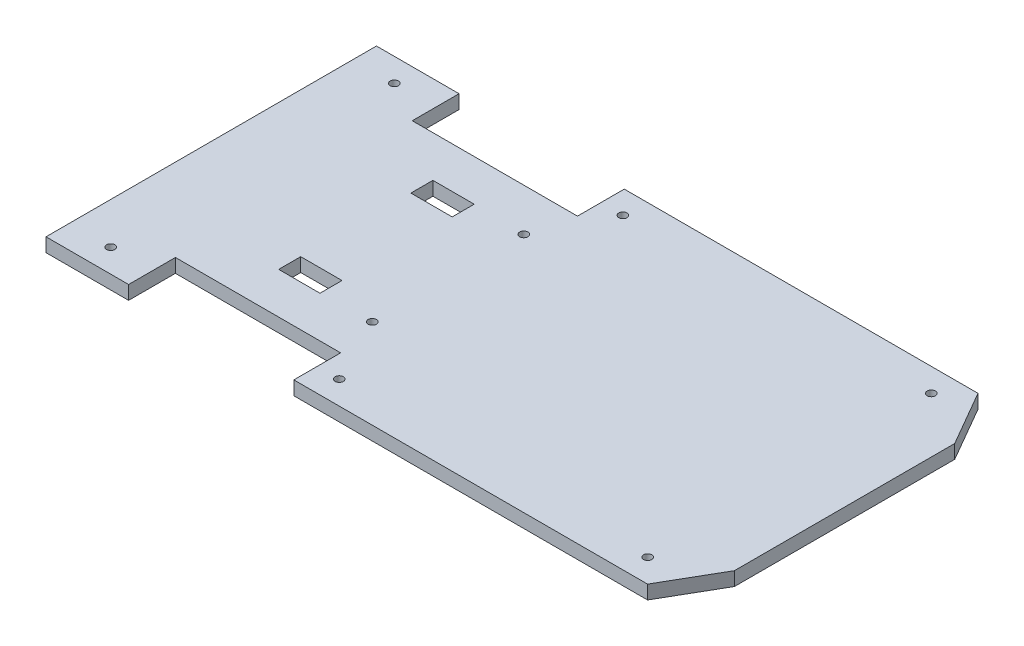
ISO-10303-21;
HEADER;
FILE_DESCRIPTION(('STEP AP214'),'2;1');
FILE_NAME('part.step','',(''),(''),'','','');
FILE_SCHEMA(('AUTOMOTIVE_DESIGN { 1 0 10303 214 1 1 1 1 }'));
ENDSEC;
DATA;
#1=APPLICATION_CONTEXT('core data for automotive mechanical design processes');
#2=APPLICATION_PROTOCOL_DEFINITION('international standard','automotive_design',2000,#1);
#3=PRODUCT_CONTEXT('',#1,'mechanical');
#4=PRODUCT('Part','Part','',(#3));
#5=PRODUCT_RELATED_PRODUCT_CATEGORY('part','',(#4));
#6=PRODUCT_DEFINITION_FORMATION('','',#4);
#7=PRODUCT_DEFINITION_CONTEXT('part definition',#1,'design');
#8=PRODUCT_DEFINITION('design','',#6,#7);
#9=PRODUCT_DEFINITION_SHAPE('','',#8);
#10=(LENGTH_UNIT() NAMED_UNIT(*) SI_UNIT(.MILLI.,.METRE.));
#11=(NAMED_UNIT(*) PLANE_ANGLE_UNIT() SI_UNIT($,.RADIAN.));
#12=(NAMED_UNIT(*) SI_UNIT($,.STERADIAN.) SOLID_ANGLE_UNIT());
#13=UNCERTAINTY_MEASURE_WITH_UNIT(LENGTH_MEASURE(1.E-05),#10,'distance_accuracy_value','');
#14=(GEOMETRIC_REPRESENTATION_CONTEXT(3) GLOBAL_UNCERTAINTY_ASSIGNED_CONTEXT((#13)) GLOBAL_UNIT_ASSIGNED_CONTEXT((#10,
#11,#12)) REPRESENTATION_CONTEXT('',''));
#15=CARTESIAN_POINT('',(0.,0.,0.));
#16=DIRECTION('',(0.,0.,1.));
#17=DIRECTION('',(1.,0.,0.));
#18=AXIS2_PLACEMENT_3D('',#15,#16,#17);
#19=CARTESIAN_POINT('',(0.,5.,0.));
#20=DIRECTION('',(0.,-1.,0.));
#21=DIRECTION('',(0.,0.,-1.));
#22=AXIS2_PLACEMENT_3D('',#19,#20,#21);
#23=PLANE('',#22);
#24=DIRECTION('',(0.,0.,1.));
#25=VECTOR('',#24,1.);
#26=CARTESIAN_POINT('',(-115.,5.,0.));
#27=LINE('',#26,#25);
#28=CARTESIAN_POINT('',(-115.,5.,-60.));
#29=VERTEX_POINT('',#28);
#30=CARTESIAN_POINT('',(-115.,5.,60.));
#31=VERTEX_POINT('',#30);
#32=EDGE_CURVE('E386',#29,#31,#27,.T.);
#33=ORIENTED_EDGE('',*,*,#32,.T.);
#34=DIRECTION('',(-1.,0.,0.));
#35=VECTOR('',#34,1.);
#36=CARTESIAN_POINT('',(-115.,5.,60.));
#37=LINE('',#36,#35);
#38=CARTESIAN_POINT('',(-85.,5.,60.));
#39=VERTEX_POINT('',#38);
#40=EDGE_CURVE('E246',#39,#31,#37,.T.);
#41=ORIENTED_EDGE('',*,*,#40,.F.);
#42=DIRECTION('',(0.,0.,1.));
#43=VECTOR('',#42,1.);
#44=CARTESIAN_POINT('',(-85.,5.,60.));
#45=LINE('',#44,#43);
#46=CARTESIAN_POINT('',(-85.,5.,43.));
#47=VERTEX_POINT('',#46);
#48=EDGE_CURVE('E250',#47,#39,#45,.T.);
#49=ORIENTED_EDGE('',*,*,#48,.F.);
#50=DIRECTION('',(-1.,0.,0.));
#51=VECTOR('',#50,1.);
#52=CARTESIAN_POINT('',(-85.,5.,43.));
#53=LINE('',#52,#51);
#54=CARTESIAN_POINT('',(-25.,5.,43.));
#55=VERTEX_POINT('',#54);
#56=EDGE_CURVE('E255',#55,#47,#53,.T.);
#57=ORIENTED_EDGE('',*,*,#56,.F.);
#58=DIRECTION('',(0.,0.,-1.));
#59=VECTOR('',#58,1.);
#60=CARTESIAN_POINT('',(-25.,5.,43.));
#61=LINE('',#60,#59);
#62=CARTESIAN_POINT('',(-25.,5.,60.));
#63=VERTEX_POINT('',#62);
#64=EDGE_CURVE('E259',#63,#55,#61,.T.);
#65=ORIENTED_EDGE('',*,*,#64,.F.);
#66=DIRECTION('',(-1.,0.,0.));
#67=VECTOR('',#66,1.);
#68=CARTESIAN_POINT('',(-25.,5.,60.));
#69=LINE('',#68,#67);
#70=CARTESIAN_POINT('',(103.452994616208,5.,60.));
#71=VERTEX_POINT('',#70);
#72=EDGE_CURVE('E263',#71,#63,#69,.T.);
#73=ORIENTED_EDGE('',*,*,#72,.F.);
#74=DIRECTION('',(-0.499999999999998,0.,0.86602540378444));
#75=VECTOR('',#74,1.);
#76=CARTESIAN_POINT('',(103.452994616208,5.,60.));
#77=LINE('',#76,#75);
#78=CARTESIAN_POINT('',(115.,5.,40.));
#79=VERTEX_POINT('',#78);
#80=EDGE_CURVE('E267',#79,#71,#77,.T.);
#81=ORIENTED_EDGE('',*,*,#80,.F.);
#82=DIRECTION('',(0.,0.,-1.));
#83=VECTOR('',#82,1.);
#84=CARTESIAN_POINT('',(115.,5.,0.));
#85=LINE('',#84,#83);
#86=CARTESIAN_POINT('',(115.,5.,-40.));
#87=VERTEX_POINT('',#86);
#88=EDGE_CURVE('E389',#79,#87,#85,.T.);
#89=ORIENTED_EDGE('',*,*,#88,.T.);
#90=DIRECTION('',(-0.499999999999998,0.,-0.86602540378444));
#91=VECTOR('',#90,1.);
#92=CARTESIAN_POINT('',(103.452994616208,5.,-60.));
#93=LINE('',#92,#91);
#94=CARTESIAN_POINT('',(103.452994616208,5.,-60.));
#95=VERTEX_POINT('',#94);
#96=EDGE_CURVE('E393',#87,#95,#93,.T.);
#97=ORIENTED_EDGE('',*,*,#96,.T.);
#98=DIRECTION('',(-1.,0.,0.));
#99=VECTOR('',#98,1.);
#100=CARTESIAN_POINT('',(-25.,5.,-60.));
#101=LINE('',#100,#99);
#102=CARTESIAN_POINT('',(-25.,5.,-60.));
#103=VERTEX_POINT('',#102);
#104=EDGE_CURVE('E396',#95,#103,#101,.T.);
#105=ORIENTED_EDGE('',*,*,#104,.T.);
#106=DIRECTION('',(0.,0.,1.));
#107=VECTOR('',#106,1.);
#108=CARTESIAN_POINT('',(-25.,5.,-43.));
#109=LINE('',#108,#107);
#110=CARTESIAN_POINT('',(-25.,5.,-43.));
#111=VERTEX_POINT('',#110);
#112=EDGE_CURVE('E399',#103,#111,#109,.T.);
#113=ORIENTED_EDGE('',*,*,#112,.T.);
#114=DIRECTION('',(-1.,0.,0.));
#115=VECTOR('',#114,1.);
#116=CARTESIAN_POINT('',(-85.,5.,-43.));
#117=LINE('',#116,#115);
#118=CARTESIAN_POINT('',(-85.,5.,-43.));
#119=VERTEX_POINT('',#118);
#120=EDGE_CURVE('E402',#111,#119,#117,.T.);
#121=ORIENTED_EDGE('',*,*,#120,.T.);
#122=DIRECTION('',(0.,0.,-1.));
#123=VECTOR('',#122,1.);
#124=CARTESIAN_POINT('',(-85.,5.,-60.));
#125=LINE('',#124,#123);
#126=CARTESIAN_POINT('',(-85.,5.,-60.));
#127=VERTEX_POINT('',#126);
#128=EDGE_CURVE('E405',#119,#127,#125,.T.);
#129=ORIENTED_EDGE('',*,*,#128,.T.);
#130=DIRECTION('',(-1.,0.,0.));
#131=VECTOR('',#130,1.);
#132=CARTESIAN_POINT('',(-115.,5.,-60.));
#133=LINE('',#132,#131);
#134=EDGE_CURVE('E408',#127,#29,#133,.T.);
#135=ORIENTED_EDGE('',*,*,#134,.T.);
#136=EDGE_LOOP('',(#33,#41,#49,#57,#65,#73,#81,#89,#97,#105,#113,#121,#129,#135));
#137=FACE_BOUND('',#136,.T.);
#138=DIRECTION('',(0.,0.,1.));
#139=VECTOR('',#138,1.);
#140=CARTESIAN_POINT('',(-62.5,5.,-28.));
#141=LINE('',#140,#139);
#142=CARTESIAN_POINT('',(-62.5,5.,-28.));
#143=VERTEX_POINT('',#142);
#144=CARTESIAN_POINT('',(-62.5,5.,-20.));
#145=VERTEX_POINT('',#144);
#146=EDGE_CURVE('E348',#143,#145,#141,.T.);
#147=ORIENTED_EDGE('',*,*,#146,.F.);
#148=DIRECTION('',(-1.,0.,0.));
#149=VECTOR('',#148,1.);
#150=CARTESIAN_POINT('',(-62.5,5.,-28.));
#151=LINE('',#150,#149);
#152=CARTESIAN_POINT('',(-47.5,5.,-28.));
#153=VERTEX_POINT('',#152);
#154=EDGE_CURVE('E358',#153,#143,#151,.T.);
#155=ORIENTED_EDGE('',*,*,#154,.F.);
#156=DIRECTION('',(0.,0.,-1.));
#157=VECTOR('',#156,1.);
#158=CARTESIAN_POINT('',(-47.5,5.,-28.));
#159=LINE('',#158,#157);
#160=CARTESIAN_POINT('',(-47.5,5.,-20.));
#161=VERTEX_POINT('',#160);
#162=EDGE_CURVE('E355',#161,#153,#159,.T.);
#163=ORIENTED_EDGE('',*,*,#162,.F.);
#164=DIRECTION('',(1.,0.,0.));
#165=VECTOR('',#164,1.);
#166=CARTESIAN_POINT('',(-62.5,5.,-20.));
#167=LINE('',#166,#165);
#168=EDGE_CURVE('E351',#145,#161,#167,.T.);
#169=ORIENTED_EDGE('',*,*,#168,.F.);
#170=EDGE_LOOP('',(#147,#155,#163,#169));
#171=FACE_BOUND('',#170,.T.);
#172=CARTESIAN_POINT('',(-100.,5.,-51.5));
#173=DIRECTION('',(0.,1.,0.));
#174=DIRECTION('',(0.,0.,1.));
#175=AXIS2_PLACEMENT_3D('',#172,#173,#174);
#176=CIRCLE('',#175,1.5);
#177=CARTESIAN_POINT('',(-100.,5.,-50.));
#178=VERTEX_POINT('',#177);
#179=EDGE_CURVE('E341',#178,#178,#176,.T.);
#180=ORIENTED_EDGE('',*,*,#179,.F.);
#181=EDGE_LOOP('',(#180));
#182=FACE_BOUND('',#181,.T.);
#183=CARTESIAN_POINT('',(-17.,5.,-51.5));
#184=DIRECTION('',(0.,1.,0.));
#185=DIRECTION('',(0.,0.,1.));
#186=AXIS2_PLACEMENT_3D('',#183,#184,#185);
#187=CIRCLE('',#186,1.5);
#188=CARTESIAN_POINT('',(-17.,5.,-50.));
#189=VERTEX_POINT('',#188);
#190=EDGE_CURVE('E333',#189,#189,#187,.T.);
#191=ORIENTED_EDGE('',*,*,#190,.F.);
#192=EDGE_LOOP('',(#191));
#193=FACE_BOUND('',#192,.T.);
#194=CARTESIAN_POINT('',(95.,5.,-51.5));
#195=DIRECTION('',(0.,1.,0.));
#196=DIRECTION('',(0.,0.,1.));
#197=AXIS2_PLACEMENT_3D('',#194,#195,#196);
#198=CIRCLE('',#197,1.5);
#199=CARTESIAN_POINT('',(95.,5.,-50.));
#200=VERTEX_POINT('',#199);
#201=EDGE_CURVE('E325',#200,#200,#198,.T.);
#202=ORIENTED_EDGE('',*,*,#201,.F.);
#203=EDGE_LOOP('',(#202));
#204=FACE_BOUND('',#203,.T.);
#205=CARTESIAN_POINT('',(-29.,5.,-27.5));
#206=DIRECTION('',(0.,1.,0.));
#207=DIRECTION('',(0.,0.,1.));
#208=AXIS2_PLACEMENT_3D('',#205,#206,#207);
#209=CIRCLE('',#208,1.5);
#210=CARTESIAN_POINT('',(-29.,5.,-26.));
#211=VERTEX_POINT('',#210);
#212=EDGE_CURVE('E317',#211,#211,#209,.T.);
#213=ORIENTED_EDGE('',*,*,#212,.F.);
#214=EDGE_LOOP('',(#213));
#215=FACE_BOUND('',#214,.T.);
#216=CARTESIAN_POINT('',(-29.,5.,27.5));
#217=DIRECTION('',(0.,-1.,0.));
#218=DIRECTION('',(0.,0.,-1.));
#219=AXIS2_PLACEMENT_3D('',#216,#217,#218);
#220=CIRCLE('',#219,1.5);
#221=CARTESIAN_POINT('',(-29.,5.,26.));
#222=VERTEX_POINT('',#221);
#223=EDGE_CURVE('E611',#222,#222,#220,.T.);
#224=ORIENTED_EDGE('',*,*,#223,.T.);
#225=EDGE_LOOP('',(#224));
#226=FACE_BOUND('',#225,.T.);
#227=CARTESIAN_POINT('',(95.,5.,51.5));
#228=DIRECTION('',(0.,-1.,0.));
#229=DIRECTION('',(0.,0.,-1.));
#230=AXIS2_PLACEMENT_3D('',#227,#228,#229);
#231=CIRCLE('',#230,1.5);
#232=CARTESIAN_POINT('',(95.,5.,50.));
#233=VERTEX_POINT('',#232);
#234=EDGE_CURVE('E622',#233,#233,#231,.T.);
#235=ORIENTED_EDGE('',*,*,#234,.T.);
#236=EDGE_LOOP('',(#235));
#237=FACE_BOUND('',#236,.T.);
#238=CARTESIAN_POINT('',(-17.,5.,51.5));
#239=DIRECTION('',(0.,-1.,0.));
#240=DIRECTION('',(0.,0.,-1.));
#241=AXIS2_PLACEMENT_3D('',#238,#239,#240);
#242=CIRCLE('',#241,1.5);
#243=CARTESIAN_POINT('',(-17.,5.,50.));
#244=VERTEX_POINT('',#243);
#245=EDGE_CURVE('E630',#244,#244,#242,.T.);
#246=ORIENTED_EDGE('',*,*,#245,.T.);
#247=EDGE_LOOP('',(#246));
#248=FACE_BOUND('',#247,.T.);
#249=CARTESIAN_POINT('',(-100.,5.,51.5));
#250=DIRECTION('',(0.,-1.,0.));
#251=DIRECTION('',(0.,0.,-1.));
#252=AXIS2_PLACEMENT_3D('',#249,#250,#251);
#253=CIRCLE('',#252,1.5);
#254=CARTESIAN_POINT('',(-100.,5.,50.));
#255=VERTEX_POINT('',#254);
#256=EDGE_CURVE('E229',#255,#255,#253,.T.);
#257=ORIENTED_EDGE('',*,*,#256,.T.);
#258=EDGE_LOOP('',(#257));
#259=FACE_BOUND('',#258,.T.);
#260=DIRECTION('',(-1.,0.,0.));
#261=VECTOR('',#260,1.);
#262=CARTESIAN_POINT('',(-62.5,5.,28.));
#263=LINE('',#262,#261);
#264=CARTESIAN_POINT('',(-47.5,5.,28.));
#265=VERTEX_POINT('',#264);
#266=CARTESIAN_POINT('',(-62.5,5.,28.));
#267=VERTEX_POINT('',#266);
#268=EDGE_CURVE('E195',#265,#267,#263,.T.);
#269=ORIENTED_EDGE('',*,*,#268,.T.);
#270=DIRECTION('',(0.,0.,-1.));
#271=VECTOR('',#270,1.);
#272=CARTESIAN_POINT('',(-62.5,5.,28.));
#273=LINE('',#272,#271);
#274=CARTESIAN_POINT('',(-62.5,5.,20.));
#275=VERTEX_POINT('',#274);
#276=EDGE_CURVE('E206',#267,#275,#273,.T.);
#277=ORIENTED_EDGE('',*,*,#276,.T.);
#278=DIRECTION('',(1.,0.,0.));
#279=VECTOR('',#278,1.);
#280=CARTESIAN_POINT('',(-62.5,5.,20.));
#281=LINE('',#280,#279);
#282=CARTESIAN_POINT('',(-47.5,5.,20.));
#283=VERTEX_POINT('',#282);
#284=EDGE_CURVE('E220',#275,#283,#281,.T.);
#285=ORIENTED_EDGE('',*,*,#284,.T.);
#286=DIRECTION('',(0.,0.,1.));
#287=VECTOR('',#286,1.);
#288=CARTESIAN_POINT('',(-47.5,5.,28.));
#289=LINE('',#288,#287);
#290=EDGE_CURVE('E216',#283,#265,#289,.T.);
#291=ORIENTED_EDGE('',*,*,#290,.T.);
#292=EDGE_LOOP('',(#269,#277,#285,#291));
#293=FACE_BOUND('',#292,.T.);
#294=ADVANCED_FACE('F39',(#137,#171,#182,#193,#204,#215,#226,#237,#248,#259,#293),#23,.F.);
#295=CARTESIAN_POINT('',(0.,0.,0.));
#296=DIRECTION('',(0.,-1.,0.));
#297=DIRECTION('',(0.,0.,-1.));
#298=AXIS2_PLACEMENT_3D('',#295,#296,#297);
#299=PLANE('',#298);
#300=CARTESIAN_POINT('',(95.,0.,-51.5));
#301=DIRECTION('',(0.,1.,0.));
#302=DIRECTION('',(0.,0.,1.));
#303=AXIS2_PLACEMENT_3D('',#300,#301,#302);
#304=CIRCLE('',#303,1.5);
#305=CARTESIAN_POINT('',(95.,0.,-50.));
#306=VERTEX_POINT('',#305);
#307=EDGE_CURVE('E321',#306,#306,#304,.T.);
#308=ORIENTED_EDGE('',*,*,#307,.T.);
#309=EDGE_LOOP('',(#308));
#310=FACE_BOUND('',#309,.T.);
#311=CARTESIAN_POINT('',(-100.,0.,-51.5));
#312=DIRECTION('',(0.,1.,0.));
#313=DIRECTION('',(0.,0.,1.));
#314=AXIS2_PLACEMENT_3D('',#311,#312,#313);
#315=CIRCLE('',#314,1.5);
#316=CARTESIAN_POINT('',(-100.,0.,-50.));
#317=VERTEX_POINT('',#316);
#318=EDGE_CURVE('E337',#317,#317,#315,.T.);
#319=ORIENTED_EDGE('',*,*,#318,.T.);
#320=EDGE_LOOP('',(#319));
#321=FACE_BOUND('',#320,.T.);
#322=DIRECTION('',(0.,0.,1.));
#323=VECTOR('',#322,1.);
#324=CARTESIAN_POINT('',(-115.,0.,0.));
#325=LINE('',#324,#323);
#326=CARTESIAN_POINT('',(-115.,0.,-60.));
#327=VERTEX_POINT('',#326);
#328=CARTESIAN_POINT('',(-115.,0.,60.));
#329=VERTEX_POINT('',#328);
#330=EDGE_CURVE('E385',#327,#329,#325,.T.);
#331=ORIENTED_EDGE('',*,*,#330,.F.);
#332=DIRECTION('',(-1.,0.,0.));
#333=VECTOR('',#332,1.);
#334=CARTESIAN_POINT('',(-115.,0.,-60.));
#335=LINE('',#334,#333);
#336=CARTESIAN_POINT('',(-85.,0.,-60.));
#337=VERTEX_POINT('',#336);
#338=EDGE_CURVE('E390',#337,#327,#335,.T.);
#339=ORIENTED_EDGE('',*,*,#338,.F.);
#340=DIRECTION('',(0.,0.,-1.));
#341=VECTOR('',#340,1.);
#342=CARTESIAN_POINT('',(-85.,0.,-60.));
#343=LINE('',#342,#341);
#344=CARTESIAN_POINT('',(-85.,0.,-43.));
#345=VERTEX_POINT('',#344);
#346=EDGE_CURVE('E429',#345,#337,#343,.T.);
#347=ORIENTED_EDGE('',*,*,#346,.F.);
#348=DIRECTION('',(-1.,0.,0.));
#349=VECTOR('',#348,1.);
#350=CARTESIAN_POINT('',(-85.,0.,-43.));
#351=LINE('',#350,#349);
#352=CARTESIAN_POINT('',(-25.,0.,-43.));
#353=VERTEX_POINT('',#352);
#354=EDGE_CURVE('E426',#353,#345,#351,.T.);
#355=ORIENTED_EDGE('',*,*,#354,.F.);
#356=DIRECTION('',(0.,0.,1.));
#357=VECTOR('',#356,1.);
#358=CARTESIAN_POINT('',(-25.,0.,-43.));
#359=LINE('',#358,#357);
#360=CARTESIAN_POINT('',(-25.,0.,-60.));
#361=VERTEX_POINT('',#360);
#362=EDGE_CURVE('E423',#361,#353,#359,.T.);
#363=ORIENTED_EDGE('',*,*,#362,.F.);
#364=DIRECTION('',(-1.,0.,0.));
#365=VECTOR('',#364,1.);
#366=CARTESIAN_POINT('',(-25.,0.,-60.));
#367=LINE('',#366,#365);
#368=CARTESIAN_POINT('',(103.452994616208,0.,-60.));
#369=VERTEX_POINT('',#368);
#370=EDGE_CURVE('E420',#369,#361,#367,.T.);
#371=ORIENTED_EDGE('',*,*,#370,.F.);
#372=DIRECTION('',(-0.499999999999998,0.,-0.86602540378444));
#373=VECTOR('',#372,1.);
#374=CARTESIAN_POINT('',(103.452994616208,0.,-60.));
#375=LINE('',#374,#373);
#376=CARTESIAN_POINT('',(115.,0.,-40.));
#377=VERTEX_POINT('',#376);
#378=EDGE_CURVE('E417',#377,#369,#375,.T.);
#379=ORIENTED_EDGE('',*,*,#378,.F.);
#380=DIRECTION('',(0.,0.,-1.));
#381=VECTOR('',#380,1.);
#382=CARTESIAN_POINT('',(115.,0.,0.));
#383=LINE('',#382,#381);
#384=CARTESIAN_POINT('',(115.,0.,40.));
#385=VERTEX_POINT('',#384);
#386=EDGE_CURVE('E414',#385,#377,#383,.T.);
#387=ORIENTED_EDGE('',*,*,#386,.F.);
#388=DIRECTION('',(-0.499999999999998,0.,0.86602540378444));
#389=VECTOR('',#388,1.);
#390=CARTESIAN_POINT('',(103.452994616208,0.,60.));
#391=LINE('',#390,#389);
#392=CARTESIAN_POINT('',(103.452994616208,0.,60.));
#393=VERTEX_POINT('',#392);
#394=EDGE_CURVE('E251',#385,#393,#391,.T.);
#395=ORIENTED_EDGE('',*,*,#394,.T.);
#396=DIRECTION('',(-1.,0.,0.));
#397=VECTOR('',#396,1.);
#398=CARTESIAN_POINT('',(-25.,0.,60.));
#399=LINE('',#398,#397);
#400=CARTESIAN_POINT('',(-25.,0.,60.));
#401=VERTEX_POINT('',#400);
#402=EDGE_CURVE('E287',#393,#401,#399,.T.);
#403=ORIENTED_EDGE('',*,*,#402,.T.);
#404=DIRECTION('',(0.,0.,-1.));
#405=VECTOR('',#404,1.);
#406=CARTESIAN_POINT('',(-25.,0.,43.));
#407=LINE('',#406,#405);
#408=CARTESIAN_POINT('',(-25.,0.,43.));
#409=VERTEX_POINT('',#408);
#410=EDGE_CURVE('E283',#401,#409,#407,.T.);
#411=ORIENTED_EDGE('',*,*,#410,.T.);
#412=DIRECTION('',(-1.,0.,0.));
#413=VECTOR('',#412,1.);
#414=CARTESIAN_POINT('',(-85.,0.,43.));
#415=LINE('',#414,#413);
#416=CARTESIAN_POINT('',(-85.,0.,43.));
#417=VERTEX_POINT('',#416);
#418=EDGE_CURVE('E279',#409,#417,#415,.T.);
#419=ORIENTED_EDGE('',*,*,#418,.T.);
#420=DIRECTION('',(0.,0.,1.));
#421=VECTOR('',#420,1.);
#422=CARTESIAN_POINT('',(-85.,0.,60.));
#423=LINE('',#422,#421);
#424=CARTESIAN_POINT('',(-85.,0.,60.));
#425=VERTEX_POINT('',#424);
#426=EDGE_CURVE('E275',#417,#425,#423,.T.);
#427=ORIENTED_EDGE('',*,*,#426,.T.);
#428=DIRECTION('',(-1.,0.,0.));
#429=VECTOR('',#428,1.);
#430=CARTESIAN_POINT('',(-115.,0.,60.));
#431=LINE('',#430,#429);
#432=EDGE_CURVE('E202',#425,#329,#431,.T.);
#433=ORIENTED_EDGE('',*,*,#432,.T.);
#434=EDGE_LOOP('',(#331,#339,#347,#355,#363,#371,#379,#387,#395,#403,#411,#419,#427,#433));
#435=FACE_BOUND('',#434,.T.);
#436=DIRECTION('',(-1.,0.,0.));
#437=VECTOR('',#436,1.);
#438=CARTESIAN_POINT('',(-62.5,0.,-28.));
#439=LINE('',#438,#437);
#440=CARTESIAN_POINT('',(-47.5,0.,-28.));
#441=VERTEX_POINT('',#440);
#442=CARTESIAN_POINT('',(-62.5,0.,-28.));
#443=VERTEX_POINT('',#442);
#444=EDGE_CURVE('E352',#441,#443,#439,.T.);
#445=ORIENTED_EDGE('',*,*,#444,.T.);
#446=DIRECTION('',(0.,0.,1.));
#447=VECTOR('',#446,1.);
#448=CARTESIAN_POINT('',(-62.5,0.,-28.));
#449=LINE('',#448,#447);
#450=CARTESIAN_POINT('',(-62.5,0.,-20.));
#451=VERTEX_POINT('',#450);
#452=EDGE_CURVE('E63',#443,#451,#449,.T.);
#453=ORIENTED_EDGE('',*,*,#452,.T.);
#454=DIRECTION('',(1.,0.,0.));
#455=VECTOR('',#454,1.);
#456=CARTESIAN_POINT('',(-62.5,0.,-20.));
#457=LINE('',#456,#455);
#458=CARTESIAN_POINT('',(-47.5,0.,-20.));
#459=VERTEX_POINT('',#458);
#460=EDGE_CURVE('E364',#451,#459,#457,.T.);
#461=ORIENTED_EDGE('',*,*,#460,.T.);
#462=DIRECTION('',(0.,0.,-1.));
#463=VECTOR('',#462,1.);
#464=CARTESIAN_POINT('',(-47.5,0.,-28.));
#465=LINE('',#464,#463);
#466=EDGE_CURVE('E368',#459,#441,#465,.T.);
#467=ORIENTED_EDGE('',*,*,#466,.T.);
#468=EDGE_LOOP('',(#445,#453,#461,#467));
#469=FACE_BOUND('',#468,.T.);
#470=CARTESIAN_POINT('',(-17.,0.,-51.5));
#471=DIRECTION('',(0.,1.,0.));
#472=DIRECTION('',(0.,0.,1.));
#473=AXIS2_PLACEMENT_3D('',#470,#471,#472);
#474=CIRCLE('',#473,1.5);
#475=CARTESIAN_POINT('',(-17.,0.,-50.));
#476=VERTEX_POINT('',#475);
#477=EDGE_CURVE('E329',#476,#476,#474,.T.);
#478=ORIENTED_EDGE('',*,*,#477,.T.);
#479=EDGE_LOOP('',(#478));
#480=FACE_BOUND('',#479,.T.);
#481=CARTESIAN_POINT('',(-29.,0.,-27.5));
#482=DIRECTION('',(0.,1.,0.));
#483=DIRECTION('',(0.,0.,1.));
#484=AXIS2_PLACEMENT_3D('',#481,#482,#483);
#485=CIRCLE('',#484,1.5);
#486=CARTESIAN_POINT('',(-29.,0.,-26.));
#487=VERTEX_POINT('',#486);
#488=EDGE_CURVE('E316',#487,#487,#485,.T.);
#489=ORIENTED_EDGE('',*,*,#488,.T.);
#490=EDGE_LOOP('',(#489));
#491=FACE_BOUND('',#490,.T.);
#492=CARTESIAN_POINT('',(-29.,0.,27.5));
#493=DIRECTION('',(0.,-1.,0.));
#494=DIRECTION('',(0.,0.,-1.));
#495=AXIS2_PLACEMENT_3D('',#492,#493,#494);
#496=CIRCLE('',#495,1.5);
#497=CARTESIAN_POINT('',(-29.,0.,26.));
#498=VERTEX_POINT('',#497);
#499=EDGE_CURVE('E614',#498,#498,#496,.T.);
#500=ORIENTED_EDGE('',*,*,#499,.F.);
#501=EDGE_LOOP('',(#500));
#502=FACE_BOUND('',#501,.T.);
#503=CARTESIAN_POINT('',(95.,0.,51.5));
#504=DIRECTION('',(0.,-1.,0.));
#505=DIRECTION('',(0.,0.,-1.));
#506=AXIS2_PLACEMENT_3D('',#503,#504,#505);
#507=CIRCLE('',#506,1.5);
#508=CARTESIAN_POINT('',(95.,0.,50.));
#509=VERTEX_POINT('',#508);
#510=EDGE_CURVE('E619',#509,#509,#507,.T.);
#511=ORIENTED_EDGE('',*,*,#510,.F.);
#512=EDGE_LOOP('',(#511));
#513=FACE_BOUND('',#512,.T.);
#514=CARTESIAN_POINT('',(-17.,0.,51.5));
#515=DIRECTION('',(0.,-1.,0.));
#516=DIRECTION('',(0.,0.,-1.));
#517=AXIS2_PLACEMENT_3D('',#514,#515,#516);
#518=CIRCLE('',#517,1.5);
#519=CARTESIAN_POINT('',(-17.,0.,50.));
#520=VERTEX_POINT('',#519);
#521=EDGE_CURVE('E626',#520,#520,#518,.T.);
#522=ORIENTED_EDGE('',*,*,#521,.F.);
#523=EDGE_LOOP('',(#522));
#524=FACE_BOUND('',#523,.T.);
#525=CARTESIAN_POINT('',(-100.,0.,51.5));
#526=DIRECTION('',(0.,-1.,0.));
#527=DIRECTION('',(0.,0.,-1.));
#528=AXIS2_PLACEMENT_3D('',#525,#526,#527);
#529=CIRCLE('',#528,1.5);
#530=CARTESIAN_POINT('',(-100.,0.,50.));
#531=VERTEX_POINT('',#530);
#532=EDGE_CURVE('E634',#531,#531,#529,.T.);
#533=ORIENTED_EDGE('',*,*,#532,.F.);
#534=EDGE_LOOP('',(#533));
#535=FACE_BOUND('',#534,.T.);
#536=DIRECTION('',(0.,0.,-1.));
#537=VECTOR('',#536,1.);
#538=CARTESIAN_POINT('',(-62.5,0.,28.));
#539=LINE('',#538,#537);
#540=CARTESIAN_POINT('',(-62.5,0.,28.));
#541=VERTEX_POINT('',#540);
#542=CARTESIAN_POINT('',(-62.5,0.,20.));
#543=VERTEX_POINT('',#542);
#544=EDGE_CURVE('E226',#541,#543,#539,.T.);
#545=ORIENTED_EDGE('',*,*,#544,.F.);
#546=DIRECTION('',(-1.,0.,0.));
#547=VECTOR('',#546,1.);
#548=CARTESIAN_POINT('',(-62.5,0.,28.));
#549=LINE('',#548,#547);
#550=CARTESIAN_POINT('',(-47.5,0.,28.));
#551=VERTEX_POINT('',#550);
#552=EDGE_CURVE('E198',#551,#541,#549,.T.);
#553=ORIENTED_EDGE('',*,*,#552,.F.);
#554=DIRECTION('',(0.,0.,1.));
#555=VECTOR('',#554,1.);
#556=CARTESIAN_POINT('',(-47.5,0.,28.));
#557=LINE('',#556,#555);
#558=CARTESIAN_POINT('',(-47.5,0.,20.));
#559=VERTEX_POINT('',#558);
#560=EDGE_CURVE('E232',#559,#551,#557,.T.);
#561=ORIENTED_EDGE('',*,*,#560,.F.);
#562=DIRECTION('',(1.,0.,0.));
#563=VECTOR('',#562,1.);
#564=CARTESIAN_POINT('',(-62.5,0.,20.));
#565=LINE('',#564,#563);
#566=EDGE_CURVE('E214',#543,#559,#565,.T.);
#567=ORIENTED_EDGE('',*,*,#566,.F.);
#568=EDGE_LOOP('',(#545,#553,#561,#567));
#569=FACE_BOUND('',#568,.T.);
#570=ADVANCED_FACE('F466',(#310,#321,#435,#469,#480,#491,#502,#513,#524,#535,#569),#299,.T.);
#571=CARTESIAN_POINT('',(-115.,5.,0.));
#572=DIRECTION('',(1.,0.,0.));
#573=DIRECTION('',(0.,0.,-1.));
#574=AXIS2_PLACEMENT_3D('',#571,#572,#573);
#575=PLANE('',#574);
#576=ORIENTED_EDGE('',*,*,#330,.T.);
#577=DIRECTION('',(0.,-1.,0.));
#578=VECTOR('',#577,1.);
#579=CARTESIAN_POINT('',(-115.,5.,60.));
#580=LINE('',#579,#578);
#581=EDGE_CURVE('E312',#31,#329,#580,.T.);
#582=ORIENTED_EDGE('',*,*,#581,.F.);
#583=ORIENTED_EDGE('',*,*,#32,.F.);
#584=DIRECTION('',(0.,-1.,0.));
#585=VECTOR('',#584,1.);
#586=CARTESIAN_POINT('',(-115.,5.,-60.));
#587=LINE('',#586,#585);
#588=EDGE_CURVE('E411',#29,#327,#587,.T.);
#589=ORIENTED_EDGE('',*,*,#588,.T.);
#590=EDGE_LOOP('',(#576,#582,#583,#589));
#591=FACE_BOUND('',#590,.T.);
#592=ADVANCED_FACE('F41',(#591),#575,.F.);
#593=CARTESIAN_POINT('',(115.,5.,0.));
#594=DIRECTION('',(-1.,0.,0.));
#595=DIRECTION('',(0.,0.,1.));
#596=AXIS2_PLACEMENT_3D('',#593,#594,#595);
#597=PLANE('',#596);
#598=ORIENTED_EDGE('',*,*,#386,.T.);
#599=DIRECTION('',(0.,-1.,0.));
#600=VECTOR('',#599,1.);
#601=CARTESIAN_POINT('',(115.,5.,-40.));
#602=LINE('',#601,#600);
#603=EDGE_CURVE('E11',#87,#377,#602,.T.);
#604=ORIENTED_EDGE('',*,*,#603,.F.);
#605=ORIENTED_EDGE('',*,*,#88,.F.);
#606=DIRECTION('',(0.,-1.,0.));
#607=VECTOR('',#606,1.);
#608=CARTESIAN_POINT('',(115.,5.,40.));
#609=LINE('',#608,#607);
#610=EDGE_CURVE('E271',#79,#385,#609,.T.);
#611=ORIENTED_EDGE('',*,*,#610,.T.);
#612=EDGE_LOOP('',(#598,#604,#605,#611));
#613=FACE_BOUND('',#612,.T.);
#614=ADVANCED_FACE('F486',(#613),#597,.F.);
#615=CARTESIAN_POINT('',(103.452994616208,5.,-60.));
#616=DIRECTION('',(-0.86602540378444,0.,0.499999999999998));
#617=DIRECTION('',(0.499999999999998,0.,0.86602540378444));
#618=AXIS2_PLACEMENT_3D('',#615,#616,#617);
#619=PLANE('',#618);
#620=ORIENTED_EDGE('',*,*,#378,.T.);
#621=DIRECTION('',(0.,-1.,0.));
#622=VECTOR('',#621,1.);
#623=CARTESIAN_POINT('',(103.452994616208,5.,-60.));
#624=LINE('',#623,#622);
#625=EDGE_CURVE('E48',#95,#369,#624,.T.);
#626=ORIENTED_EDGE('',*,*,#625,.F.);
#627=ORIENTED_EDGE('',*,*,#96,.F.);
#628=ORIENTED_EDGE('',*,*,#603,.T.);
#629=EDGE_LOOP('',(#620,#626,#627,#628));
#630=FACE_BOUND('',#629,.T.);
#631=ADVANCED_FACE('F484',(#630),#619,.F.);
#632=CARTESIAN_POINT('',(-25.,5.,-60.));
#633=DIRECTION('',(0.,0.,1.));
#634=DIRECTION('',(1.,0.,0.));
#635=AXIS2_PLACEMENT_3D('',#632,#633,#634);
#636=PLANE('',#635);
#637=ORIENTED_EDGE('',*,*,#370,.T.);
#638=DIRECTION('',(0.,-1.,0.));
#639=VECTOR('',#638,1.);
#640=CARTESIAN_POINT('',(-25.,5.,-60.));
#641=LINE('',#640,#639);
#642=EDGE_CURVE('E449',#103,#361,#641,.T.);
#643=ORIENTED_EDGE('',*,*,#642,.F.);
#644=ORIENTED_EDGE('',*,*,#104,.F.);
#645=ORIENTED_EDGE('',*,*,#625,.T.);
#646=EDGE_LOOP('',(#637,#643,#644,#645));
#647=FACE_BOUND('',#646,.T.);
#648=ADVANCED_FACE('F458',(#647),#636,.F.);
#649=CARTESIAN_POINT('',(-25.,5.,-43.));
#650=DIRECTION('',(1.,0.,0.));
#651=DIRECTION('',(0.,0.,-1.));
#652=AXIS2_PLACEMENT_3D('',#649,#650,#651);
#653=PLANE('',#652);
#654=ORIENTED_EDGE('',*,*,#362,.T.);
#655=DIRECTION('',(0.,-1.,0.));
#656=VECTOR('',#655,1.);
#657=CARTESIAN_POINT('',(-25.,5.,-43.));
#658=LINE('',#657,#656);
#659=EDGE_CURVE('E445',#111,#353,#658,.T.);
#660=ORIENTED_EDGE('',*,*,#659,.F.);
#661=ORIENTED_EDGE('',*,*,#112,.F.);
#662=ORIENTED_EDGE('',*,*,#642,.T.);
#663=EDGE_LOOP('',(#654,#660,#661,#662));
#664=FACE_BOUND('',#663,.T.);
#665=ADVANCED_FACE('F472',(#664),#653,.F.);
#666=CARTESIAN_POINT('',(-85.,5.,-43.));
#667=DIRECTION('',(0.,0.,1.));
#668=DIRECTION('',(1.,0.,0.));
#669=AXIS2_PLACEMENT_3D('',#666,#667,#668);
#670=PLANE('',#669);
#671=ORIENTED_EDGE('',*,*,#354,.T.);
#672=DIRECTION('',(0.,-1.,0.));
#673=VECTOR('',#672,1.);
#674=CARTESIAN_POINT('',(-85.,5.,-43.));
#675=LINE('',#674,#673);
#676=EDGE_CURVE('E441',#119,#345,#675,.T.);
#677=ORIENTED_EDGE('',*,*,#676,.F.);
#678=ORIENTED_EDGE('',*,*,#120,.F.);
#679=ORIENTED_EDGE('',*,*,#659,.T.);
#680=EDGE_LOOP('',(#671,#677,#678,#679));
#681=FACE_BOUND('',#680,.T.);
#682=ADVANCED_FACE('F476',(#681),#670,.F.);
#683=CARTESIAN_POINT('',(-85.,5.,-60.));
#684=DIRECTION('',(-1.,0.,0.));
#685=DIRECTION('',(0.,0.,1.));
#686=AXIS2_PLACEMENT_3D('',#683,#684,#685);
#687=PLANE('',#686);
#688=ORIENTED_EDGE('',*,*,#346,.T.);
#689=DIRECTION('',(0.,-1.,0.));
#690=VECTOR('',#689,1.);
#691=CARTESIAN_POINT('',(-85.,5.,-60.));
#692=LINE('',#691,#690);
#693=EDGE_CURVE('E437',#127,#337,#692,.T.);
#694=ORIENTED_EDGE('',*,*,#693,.F.);
#695=ORIENTED_EDGE('',*,*,#128,.F.);
#696=ORIENTED_EDGE('',*,*,#676,.T.);
#697=EDGE_LOOP('',(#688,#694,#695,#696));
#698=FACE_BOUND('',#697,.T.);
#699=ADVANCED_FACE('F520',(#698),#687,.F.);
#700=CARTESIAN_POINT('',(-115.,5.,-60.));
#701=DIRECTION('',(0.,0.,1.));
#702=DIRECTION('',(1.,0.,0.));
#703=AXIS2_PLACEMENT_3D('',#700,#701,#702);
#704=PLANE('',#703);
#705=ORIENTED_EDGE('',*,*,#338,.T.);
#706=ORIENTED_EDGE('',*,*,#588,.F.);
#707=ORIENTED_EDGE('',*,*,#134,.F.);
#708=ORIENTED_EDGE('',*,*,#693,.T.);
#709=EDGE_LOOP('',(#705,#706,#707,#708));
#710=FACE_BOUND('',#709,.T.);
#711=ADVANCED_FACE('F518',(#710),#704,.F.);
#712=CARTESIAN_POINT('',(-62.5,5.,-28.));
#713=DIRECTION('',(1.,0.,0.));
#714=DIRECTION('',(0.,0.,-1.));
#715=AXIS2_PLACEMENT_3D('',#712,#713,#714);
#716=PLANE('',#715);
#717=ORIENTED_EDGE('',*,*,#452,.F.);
#718=DIRECTION('',(0.,-1.,0.));
#719=VECTOR('',#718,1.);
#720=CARTESIAN_POINT('',(-62.5,5.,-28.));
#721=LINE('',#720,#719);
#722=EDGE_CURVE('E361',#143,#443,#721,.T.);
#723=ORIENTED_EDGE('',*,*,#722,.F.);
#724=ORIENTED_EDGE('',*,*,#146,.T.);
#725=DIRECTION('',(0.,-1.,0.));
#726=VECTOR('',#725,1.);
#727=CARTESIAN_POINT('',(-62.5,5.,-20.));
#728=LINE('',#727,#726);
#729=EDGE_CURVE('E382',#145,#451,#728,.T.);
#730=ORIENTED_EDGE('',*,*,#729,.T.);
#731=EDGE_LOOP('',(#717,#723,#724,#730));
#732=FACE_BOUND('',#731,.T.);
#733=ADVANCED_FACE('F527',(#732),#716,.T.);
#734=CARTESIAN_POINT('',(-62.5,5.,-20.));
#735=DIRECTION('',(0.,0.,-1.));
#736=DIRECTION('',(-1.,0.,0.));
#737=AXIS2_PLACEMENT_3D('',#734,#735,#736);
#738=PLANE('',#737);
#739=ORIENTED_EDGE('',*,*,#460,.F.);
#740=ORIENTED_EDGE('',*,*,#729,.F.);
#741=ORIENTED_EDGE('',*,*,#168,.T.);
#742=DIRECTION('',(0.,-1.,0.));
#743=VECTOR('',#742,1.);
#744=CARTESIAN_POINT('',(-47.5,5.,-20.));
#745=LINE('',#744,#743);
#746=EDGE_CURVE('E379',#161,#459,#745,.T.);
#747=ORIENTED_EDGE('',*,*,#746,.T.);
#748=EDGE_LOOP('',(#739,#740,#741,#747));
#749=FACE_BOUND('',#748,.T.);
#750=ADVANCED_FACE('F540',(#749),#738,.T.);
#751=CARTESIAN_POINT('',(-47.5,5.,-28.));
#752=DIRECTION('',(-1.,0.,0.));
#753=DIRECTION('',(0.,0.,1.));
#754=AXIS2_PLACEMENT_3D('',#751,#752,#753);
#755=PLANE('',#754);
#756=ORIENTED_EDGE('',*,*,#466,.F.);
#757=ORIENTED_EDGE('',*,*,#746,.F.);
#758=ORIENTED_EDGE('',*,*,#162,.T.);
#759=DIRECTION('',(0.,-1.,0.));
#760=VECTOR('',#759,1.);
#761=CARTESIAN_POINT('',(-47.5,5.,-28.));
#762=LINE('',#761,#760);
#763=EDGE_CURVE('E55',#153,#441,#762,.T.);
#764=ORIENTED_EDGE('',*,*,#763,.T.);
#765=EDGE_LOOP('',(#756,#757,#758,#764));
#766=FACE_BOUND('',#765,.T.);
#767=ADVANCED_FACE('F543',(#766),#755,.T.);
#768=CARTESIAN_POINT('',(-62.5,5.,-28.));
#769=DIRECTION('',(0.,0.,1.));
#770=DIRECTION('',(1.,0.,0.));
#771=AXIS2_PLACEMENT_3D('',#768,#769,#770);
#772=PLANE('',#771);
#773=ORIENTED_EDGE('',*,*,#444,.F.);
#774=ORIENTED_EDGE('',*,*,#763,.F.);
#775=ORIENTED_EDGE('',*,*,#154,.T.);
#776=ORIENTED_EDGE('',*,*,#722,.T.);
#777=EDGE_LOOP('',(#773,#774,#775,#776));
#778=FACE_BOUND('',#777,.T.);
#779=ADVANCED_FACE('F547',(#778),#772,.T.);
#780=CARTESIAN_POINT('',(-100.,5.,-51.5));
#781=DIRECTION('',(0.,-1.,0.));
#782=DIRECTION('',(0.,0.,-1.));
#783=AXIS2_PLACEMENT_3D('',#780,#781,#782);
#784=CYLINDRICAL_SURFACE('',#783,1.5);
#785=ORIENTED_EDGE('',*,*,#179,.T.);
#786=EDGE_LOOP('',(#785));
#787=FACE_BOUND('',#786,.T.);
#788=ORIENTED_EDGE('',*,*,#318,.F.);
#789=EDGE_LOOP('',(#788));
#790=FACE_BOUND('',#789,.T.);
#791=ADVANCED_FACE('F551',(#787,#790),#784,.F.);
#792=CARTESIAN_POINT('',(-17.,5.,-51.5));
#793=DIRECTION('',(0.,-1.,0.));
#794=DIRECTION('',(0.,0.,-1.));
#795=AXIS2_PLACEMENT_3D('',#792,#793,#794);
#796=CYLINDRICAL_SURFACE('',#795,1.5);
#797=ORIENTED_EDGE('',*,*,#190,.T.);
#798=EDGE_LOOP('',(#797));
#799=FACE_BOUND('',#798,.T.);
#800=ORIENTED_EDGE('',*,*,#477,.F.);
#801=EDGE_LOOP('',(#800));
#802=FACE_BOUND('',#801,.T.);
#803=ADVANCED_FACE('F554',(#799,#802),#796,.F.);
#804=CARTESIAN_POINT('',(95.,5.,-51.5));
#805=DIRECTION('',(0.,-1.,0.));
#806=DIRECTION('',(0.,0.,-1.));
#807=AXIS2_PLACEMENT_3D('',#804,#805,#806);
#808=CYLINDRICAL_SURFACE('',#807,1.5);
#809=ORIENTED_EDGE('',*,*,#201,.T.);
#810=EDGE_LOOP('',(#809));
#811=FACE_BOUND('',#810,.T.);
#812=ORIENTED_EDGE('',*,*,#307,.F.);
#813=EDGE_LOOP('',(#812));
#814=FACE_BOUND('',#813,.T.);
#815=ADVANCED_FACE('F558',(#811,#814),#808,.F.);
#816=CARTESIAN_POINT('',(-29.,5.,-27.5));
#817=DIRECTION('',(0.,-1.,0.));
#818=DIRECTION('',(0.,0.,-1.));
#819=AXIS2_PLACEMENT_3D('',#816,#817,#818);
#820=CYLINDRICAL_SURFACE('',#819,1.5);
#821=ORIENTED_EDGE('',*,*,#212,.T.);
#822=EDGE_LOOP('',(#821));
#823=FACE_BOUND('',#822,.T.);
#824=ORIENTED_EDGE('',*,*,#488,.F.);
#825=EDGE_LOOP('',(#824));
#826=FACE_BOUND('',#825,.T.);
#827=ADVANCED_FACE('F562',(#823,#826),#820,.F.);
#828=CARTESIAN_POINT('',(-115.,5.,60.));
#829=DIRECTION('',(0.,0.,1.));
#830=DIRECTION('',(1.,0.,0.));
#831=AXIS2_PLACEMENT_3D('',#828,#829,#830);
#832=PLANE('',#831);
#833=ORIENTED_EDGE('',*,*,#432,.F.);
#834=DIRECTION('',(0.,-1.,0.));
#835=VECTOR('',#834,1.);
#836=CARTESIAN_POINT('',(-85.,5.,60.));
#837=LINE('',#836,#835);
#838=EDGE_CURVE('E309',#39,#425,#837,.T.);
#839=ORIENTED_EDGE('',*,*,#838,.F.);
#840=ORIENTED_EDGE('',*,*,#40,.T.);
#841=ORIENTED_EDGE('',*,*,#581,.T.);
#842=EDGE_LOOP('',(#833,#839,#840,#841));
#843=FACE_BOUND('',#842,.T.);
#844=ADVANCED_FACE('F510',(#843),#832,.T.);
#845=CARTESIAN_POINT('',(-85.,5.,60.));
#846=DIRECTION('',(1.,0.,0.));
#847=DIRECTION('',(0.,0.,-1.));
#848=AXIS2_PLACEMENT_3D('',#845,#846,#847);
#849=PLANE('',#848);
#850=ORIENTED_EDGE('',*,*,#426,.F.);
#851=DIRECTION('',(0.,-1.,0.));
#852=VECTOR('',#851,1.);
#853=CARTESIAN_POINT('',(-85.,5.,43.));
#854=LINE('',#853,#852);
#855=EDGE_CURVE('E306',#47,#417,#854,.T.);
#856=ORIENTED_EDGE('',*,*,#855,.F.);
#857=ORIENTED_EDGE('',*,*,#48,.T.);
#858=ORIENTED_EDGE('',*,*,#838,.T.);
#859=EDGE_LOOP('',(#850,#856,#857,#858));
#860=FACE_BOUND('',#859,.T.);
#861=ADVANCED_FACE('F506',(#860),#849,.T.);
#862=CARTESIAN_POINT('',(-85.,5.,43.));
#863=DIRECTION('',(0.,0.,1.));
#864=DIRECTION('',(1.,0.,0.));
#865=AXIS2_PLACEMENT_3D('',#862,#863,#864);
#866=PLANE('',#865);
#867=ORIENTED_EDGE('',*,*,#418,.F.);
#868=DIRECTION('',(0.,-1.,0.));
#869=VECTOR('',#868,1.);
#870=CARTESIAN_POINT('',(-25.,5.,43.));
#871=LINE('',#870,#869);
#872=EDGE_CURVE('E303',#55,#409,#871,.T.);
#873=ORIENTED_EDGE('',*,*,#872,.F.);
#874=ORIENTED_EDGE('',*,*,#56,.T.);
#875=ORIENTED_EDGE('',*,*,#855,.T.);
#876=EDGE_LOOP('',(#867,#873,#874,#875));
#877=FACE_BOUND('',#876,.T.);
#878=ADVANCED_FACE('F502',(#877),#866,.T.);
#879=CARTESIAN_POINT('',(-25.,5.,43.));
#880=DIRECTION('',(-1.,0.,0.));
#881=DIRECTION('',(0.,0.,1.));
#882=AXIS2_PLACEMENT_3D('',#879,#880,#881);
#883=PLANE('',#882);
#884=ORIENTED_EDGE('',*,*,#410,.F.);
#885=DIRECTION('',(0.,-1.,0.));
#886=VECTOR('',#885,1.);
#887=CARTESIAN_POINT('',(-25.,5.,60.));
#888=LINE('',#887,#886);
#889=EDGE_CURVE('E300',#63,#401,#888,.T.);
#890=ORIENTED_EDGE('',*,*,#889,.F.);
#891=ORIENTED_EDGE('',*,*,#64,.T.);
#892=ORIENTED_EDGE('',*,*,#872,.T.);
#893=EDGE_LOOP('',(#884,#890,#891,#892));
#894=FACE_BOUND('',#893,.T.);
#895=ADVANCED_FACE('F498',(#894),#883,.T.);
#896=CARTESIAN_POINT('',(-25.,5.,60.));
#897=DIRECTION('',(0.,0.,1.));
#898=DIRECTION('',(1.,0.,0.));
#899=AXIS2_PLACEMENT_3D('',#896,#897,#898);
#900=PLANE('',#899);
#901=ORIENTED_EDGE('',*,*,#402,.F.);
#902=DIRECTION('',(0.,-1.,0.));
#903=VECTOR('',#902,1.);
#904=CARTESIAN_POINT('',(103.452994616208,5.,60.));
#905=LINE('',#904,#903);
#906=EDGE_CURVE('E297',#71,#393,#905,.T.);
#907=ORIENTED_EDGE('',*,*,#906,.F.);
#908=ORIENTED_EDGE('',*,*,#72,.T.);
#909=ORIENTED_EDGE('',*,*,#889,.T.);
#910=EDGE_LOOP('',(#901,#907,#908,#909));
#911=FACE_BOUND('',#910,.T.);
#912=ADVANCED_FACE('F494',(#911),#900,.T.);
#913=CARTESIAN_POINT('',(103.452994616208,5.,60.));
#914=DIRECTION('',(0.86602540378444,0.,0.499999999999998));
#915=DIRECTION('',(0.499999999999998,0.,-0.86602540378444));
#916=AXIS2_PLACEMENT_3D('',#913,#914,#915);
#917=PLANE('',#916);
#918=ORIENTED_EDGE('',*,*,#394,.F.);
#919=ORIENTED_EDGE('',*,*,#610,.F.);
#920=ORIENTED_EDGE('',*,*,#80,.T.);
#921=ORIENTED_EDGE('',*,*,#906,.T.);
#922=EDGE_LOOP('',(#918,#919,#920,#921));
#923=FACE_BOUND('',#922,.T.);
#924=ADVANCED_FACE('F491',(#923),#917,.T.);
#925=CARTESIAN_POINT('',(-62.5,5.,28.));
#926=DIRECTION('',(-1.,0.,0.));
#927=DIRECTION('',(0.,0.,1.));
#928=AXIS2_PLACEMENT_3D('',#925,#926,#927);
#929=PLANE('',#928);
#930=ORIENTED_EDGE('',*,*,#544,.T.);
#931=DIRECTION('',(0.,-1.,0.));
#932=VECTOR('',#931,1.);
#933=CARTESIAN_POINT('',(-62.5,5.,20.));
#934=LINE('',#933,#932);
#935=EDGE_CURVE('E209',#275,#543,#934,.T.);
#936=ORIENTED_EDGE('',*,*,#935,.F.);
#937=ORIENTED_EDGE('',*,*,#276,.F.);
#938=DIRECTION('',(0.,-1.,0.));
#939=VECTOR('',#938,1.);
#940=CARTESIAN_POINT('',(-62.5,5.,28.));
#941=LINE('',#940,#939);
#942=EDGE_CURVE('E191',#267,#541,#941,.T.);
#943=ORIENTED_EDGE('',*,*,#942,.T.);
#944=EDGE_LOOP('',(#930,#936,#937,#943));
#945=FACE_BOUND('',#944,.T.);
#946=ADVANCED_FACE('F207',(#945),#929,.F.);
#947=CARTESIAN_POINT('',(-62.5,5.,28.));
#948=DIRECTION('',(0.,0.,1.));
#949=DIRECTION('',(1.,0.,0.));
#950=AXIS2_PLACEMENT_3D('',#947,#948,#949);
#951=PLANE('',#950);
#952=ORIENTED_EDGE('',*,*,#552,.T.);
#953=ORIENTED_EDGE('',*,*,#942,.F.);
#954=ORIENTED_EDGE('',*,*,#268,.F.);
#955=DIRECTION('',(0.,-1.,0.));
#956=VECTOR('',#955,1.);
#957=CARTESIAN_POINT('',(-47.5,5.,28.));
#958=LINE('',#957,#956);
#959=EDGE_CURVE('E203',#265,#551,#958,.T.);
#960=ORIENTED_EDGE('',*,*,#959,.T.);
#961=EDGE_LOOP('',(#952,#953,#954,#960));
#962=FACE_BOUND('',#961,.T.);
#963=ADVANCED_FACE('F193',(#962),#951,.F.);
#964=CARTESIAN_POINT('',(-47.5,5.,28.));
#965=DIRECTION('',(1.,0.,0.));
#966=DIRECTION('',(0.,0.,-1.));
#967=AXIS2_PLACEMENT_3D('',#964,#965,#966);
#968=PLANE('',#967);
#969=ORIENTED_EDGE('',*,*,#560,.T.);
#970=ORIENTED_EDGE('',*,*,#959,.F.);
#971=ORIENTED_EDGE('',*,*,#290,.F.);
#972=DIRECTION('',(0.,-1.,0.));
#973=VECTOR('',#972,1.);
#974=CARTESIAN_POINT('',(-47.5,5.,20.));
#975=LINE('',#974,#973);
#976=EDGE_CURVE('E241',#283,#559,#975,.T.);
#977=ORIENTED_EDGE('',*,*,#976,.T.);
#978=EDGE_LOOP('',(#969,#970,#971,#977));
#979=FACE_BOUND('',#978,.T.);
#980=ADVANCED_FACE('F583',(#979),#968,.F.);
#981=CARTESIAN_POINT('',(-62.5,5.,20.));
#982=DIRECTION('',(0.,0.,-1.));
#983=DIRECTION('',(-1.,0.,0.));
#984=AXIS2_PLACEMENT_3D('',#981,#982,#983);
#985=PLANE('',#984);
#986=ORIENTED_EDGE('',*,*,#566,.T.);
#987=ORIENTED_EDGE('',*,*,#976,.F.);
#988=ORIENTED_EDGE('',*,*,#284,.F.);
#989=ORIENTED_EDGE('',*,*,#935,.T.);
#990=EDGE_LOOP('',(#986,#987,#988,#989));
#991=FACE_BOUND('',#990,.T.);
#992=ADVANCED_FACE('F586',(#991),#985,.F.);
#993=CARTESIAN_POINT('',(-100.,5.,51.5));
#994=DIRECTION('',(0.,-1.,0.));
#995=DIRECTION('',(0.,0.,-1.));
#996=AXIS2_PLACEMENT_3D('',#993,#994,#995);
#997=CYLINDRICAL_SURFACE('',#996,1.5);
#998=ORIENTED_EDGE('',*,*,#256,.F.);
#999=EDGE_LOOP('',(#998));
#1000=FACE_BOUND('',#999,.T.);
#1001=ORIENTED_EDGE('',*,*,#532,.T.);
#1002=EDGE_LOOP('',(#1001));
#1003=FACE_BOUND('',#1002,.T.);
#1004=ADVANCED_FACE('F590',(#1000,#1003),#997,.F.);
#1005=CARTESIAN_POINT('',(-17.,5.,51.5));
#1006=DIRECTION('',(0.,-1.,0.));
#1007=DIRECTION('',(0.,0.,-1.));
#1008=AXIS2_PLACEMENT_3D('',#1005,#1006,#1007);
#1009=CYLINDRICAL_SURFACE('',#1008,1.5);
#1010=ORIENTED_EDGE('',*,*,#245,.F.);
#1011=EDGE_LOOP('',(#1010));
#1012=FACE_BOUND('',#1011,.T.);
#1013=ORIENTED_EDGE('',*,*,#521,.T.);
#1014=EDGE_LOOP('',(#1013));
#1015=FACE_BOUND('',#1014,.T.);
#1016=ADVANCED_FACE('F594',(#1012,#1015),#1009,.F.);
#1017=CARTESIAN_POINT('',(95.,5.,51.5));
#1018=DIRECTION('',(0.,-1.,0.));
#1019=DIRECTION('',(0.,0.,-1.));
#1020=AXIS2_PLACEMENT_3D('',#1017,#1018,#1019);
#1021=CYLINDRICAL_SURFACE('',#1020,1.5);
#1022=ORIENTED_EDGE('',*,*,#234,.F.);
#1023=EDGE_LOOP('',(#1022));
#1024=FACE_BOUND('',#1023,.T.);
#1025=ORIENTED_EDGE('',*,*,#510,.T.);
#1026=EDGE_LOOP('',(#1025));
#1027=FACE_BOUND('',#1026,.T.);
#1028=ADVANCED_FACE('F598',(#1024,#1027),#1021,.F.);
#1029=CARTESIAN_POINT('',(-29.,5.,27.5));
#1030=DIRECTION('',(0.,-1.,0.));
#1031=DIRECTION('',(0.,0.,-1.));
#1032=AXIS2_PLACEMENT_3D('',#1029,#1030,#1031);
#1033=CYLINDRICAL_SURFACE('',#1032,1.5);
#1034=ORIENTED_EDGE('',*,*,#223,.F.);
#1035=EDGE_LOOP('',(#1034));
#1036=FACE_BOUND('',#1035,.T.);
#1037=ORIENTED_EDGE('',*,*,#499,.T.);
#1038=EDGE_LOOP('',(#1037));
#1039=FACE_BOUND('',#1038,.T.);
#1040=ADVANCED_FACE('F602',(#1036,#1039),#1033,.F.);
#1041=CLOSED_SHELL('',(#294,#570,#592,#614,#631,#648,#665,#682,#699,#711,#733,#750,#767,#779,
#791,#803,#815,#827,#844,#861,#878,#895,#912,#924,#946,#963,#980,#992,#1004,#1016,#1028,#1040));
#1042=MANIFOLD_SOLID_BREP('B2',#1041);
#1043=ADVANCED_BREP_SHAPE_REPRESENTATION('',(#18,#1042),#14);
#1044=SHAPE_DEFINITION_REPRESENTATION(#9,#1043);
ENDSEC;
END-ISO-10303-21;
